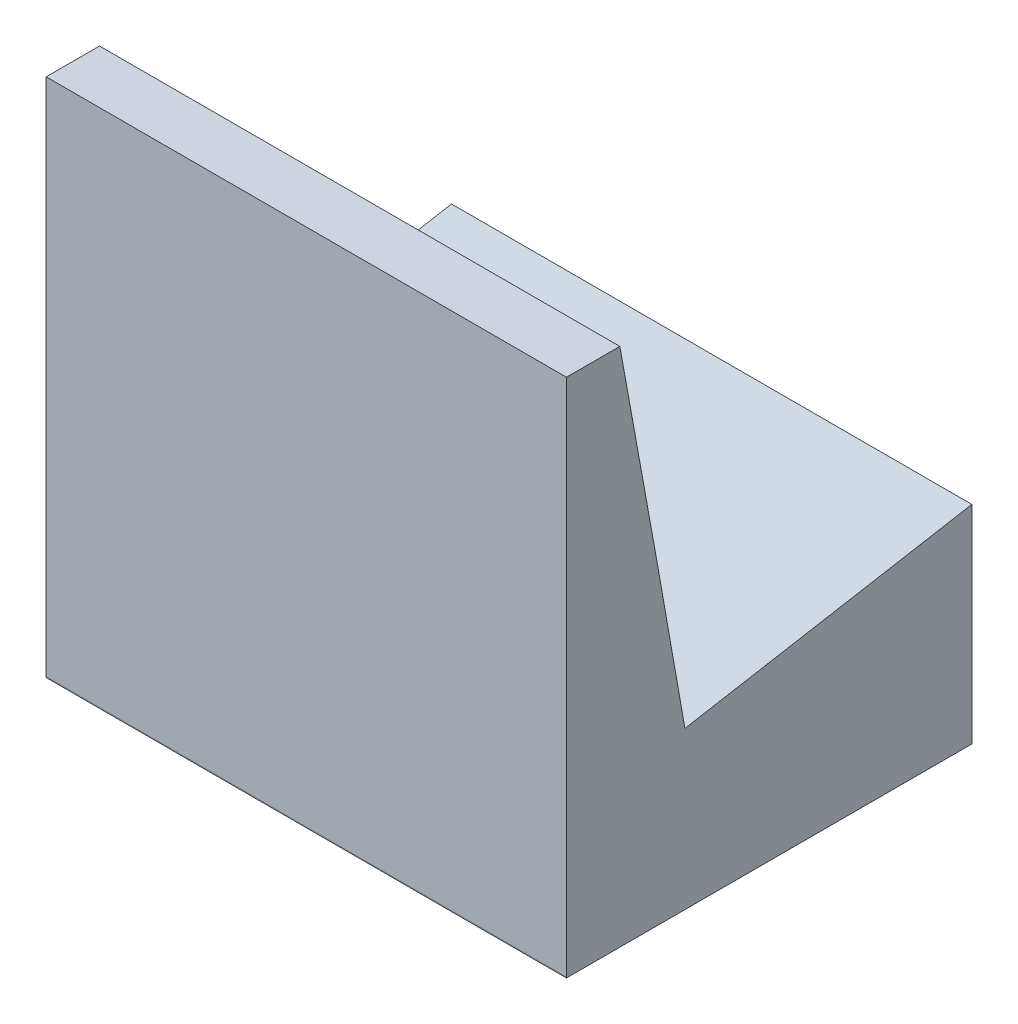
ISO-10303-21;
HEADER;
FILE_DESCRIPTION(('STEP AP214'),'2;1');
FILE_NAME('part.step','',(''),(''),'','','');
FILE_SCHEMA(('AUTOMOTIVE_DESIGN { 1 0 10303 214 1 1 1 1 }'));
ENDSEC;
DATA;
#1=APPLICATION_CONTEXT('core data for automotive mechanical design processes');
#2=APPLICATION_PROTOCOL_DEFINITION('international standard','automotive_design',2000,#1);
#3=PRODUCT_CONTEXT('',#1,'mechanical');
#4=PRODUCT('Part','Part','',(#3));
#5=PRODUCT_RELATED_PRODUCT_CATEGORY('part','',(#4));
#6=PRODUCT_DEFINITION_FORMATION('','',#4);
#7=PRODUCT_DEFINITION_CONTEXT('part definition',#1,'design');
#8=PRODUCT_DEFINITION('design','',#6,#7);
#9=PRODUCT_DEFINITION_SHAPE('','',#8);
#10=(LENGTH_UNIT() NAMED_UNIT(*) SI_UNIT(.MILLI.,.METRE.));
#11=(NAMED_UNIT(*) PLANE_ANGLE_UNIT() SI_UNIT($,.RADIAN.));
#12=(NAMED_UNIT(*) SI_UNIT($,.STERADIAN.) SOLID_ANGLE_UNIT());
#13=UNCERTAINTY_MEASURE_WITH_UNIT(LENGTH_MEASURE(1.E-05),#10,'distance_accuracy_value','');
#14=(GEOMETRIC_REPRESENTATION_CONTEXT(3) GLOBAL_UNCERTAINTY_ASSIGNED_CONTEXT((#13)) GLOBAL_UNIT_ASSIGNED_CONTEXT((#10,
#11,#12)) REPRESENTATION_CONTEXT('',''));
#15=CARTESIAN_POINT('',(0.,0.,0.));
#16=DIRECTION('',(0.,0.,1.));
#17=DIRECTION('',(1.,0.,0.));
#18=AXIS2_PLACEMENT_3D('',#15,#16,#17);
#19=CARTESIAN_POINT('',(39.,78.,-39.));
#20=DIRECTION('',(1.,0.,0.));
#21=DIRECTION('',(0.,0.,-1.));
#22=AXIS2_PLACEMENT_3D('',#19,#20,#21);
#23=PLANE('',#22);
#24=DIRECTION('',(0.,-1.,0.));
#25=VECTOR('',#24,1.);
#26=CARTESIAN_POINT('',(39.,0.,21.7672531972681));
#27=LINE('',#26,#25);
#28=CARTESIAN_POINT('',(39.,78.,21.7672531972681));
#29=VERTEX_POINT('',#28);
#30=CARTESIAN_POINT('',(39.,0.141749363036681,21.7672531972681));
#31=VERTEX_POINT('',#30);
#32=EDGE_CURVE('E128',#29,#31,#27,.T.);
#33=ORIENTED_EDGE('',*,*,#32,.T.);
#34=DIRECTION('',(0.,0.999966171621233,0.00822530322693927));
#35=VECTOR('',#34,1.);
#36=CARTESIAN_POINT('',(39.,-0.499802585268086,21.7619760594405));
#37=LINE('',#36,#35);
#38=CARTESIAN_POINT('',(39.,0.,21.766087226332));
#39=VERTEX_POINT('',#38);
#40=EDGE_CURVE('E110',#39,#31,#37,.T.);
#41=ORIENTED_EDGE('',*,*,#40,.F.);
#42=DIRECTION('',(0.,0.,1.));
#43=VECTOR('',#42,1.);
#44=CARTESIAN_POINT('',(39.,0.,-39.));
#45=LINE('',#44,#43);
#46=CARTESIAN_POINT('',(39.,0.,-39.));
#47=VERTEX_POINT('',#46);
#48=EDGE_CURVE('E138',#47,#39,#45,.T.);
#49=ORIENTED_EDGE('',*,*,#48,.F.);
#50=DIRECTION('',(0.,-1.,0.));
#51=VECTOR('',#50,1.);
#52=CARTESIAN_POINT('',(39.,78.,-39.));
#53=LINE('',#52,#51);
#54=CARTESIAN_POINT('',(39.,31.1068155014602,-39.));
#55=VERTEX_POINT('',#54);
#56=EDGE_CURVE('E11',#55,#47,#53,.T.);
#57=ORIENTED_EDGE('',*,*,#56,.F.);
#58=DIRECTION('',(0.,-0.173648177666928,0.984807753012209));
#59=VECTOR('',#58,1.);
#60=CARTESIAN_POINT('',(39.,23.4994374473151,4.14358485343244));
#61=LINE('',#60,#59);
#62=CARTESIAN_POINT('',(39.,23.5226202786766,4.01210848340461));
#63=VERTEX_POINT('',#62);
#64=EDGE_CURVE('E143',#55,#63,#61,.T.);
#65=ORIENTED_EDGE('',*,*,#64,.T.);
#66=DIRECTION('',(0.,0.984807753012209,0.173648177666924));
#67=VECTOR('',#66,1.);
#68=CARTESIAN_POINT('',(39.,0.0231828313614988,-0.131476370027743));
#69=LINE('',#68,#67);
#70=CARTESIAN_POINT('',(39.,48.2851422534618,8.37840921794532));
#71=VERTEX_POINT('',#70);
#72=EDGE_CURVE('E154',#63,#71,#69,.T.);
#73=ORIENTED_EDGE('',*,*,#72,.T.);
#74=DIRECTION('',(0.,0.983950569584254,0.178441241350822));
#75=VECTOR('',#74,1.);
#76=CARTESIAN_POINT('',(39.,0.0664015904735085,-0.366147883040432));
#77=LINE('',#76,#75);
#78=CARTESIAN_POINT('',(39.,78.,13.7672531972681));
#79=VERTEX_POINT('',#78);
#80=EDGE_CURVE('E150',#71,#79,#77,.T.);
#81=ORIENTED_EDGE('',*,*,#80,.T.);
#82=DIRECTION('',(0.,0.,1.));
#83=VECTOR('',#82,1.);
#84=CARTESIAN_POINT('',(39.,78.,-39.));
#85=LINE('',#84,#83);
#86=EDGE_CURVE('E172',#79,#29,#85,.T.);
#87=ORIENTED_EDGE('',*,*,#86,.T.);
#88=EDGE_LOOP('',(#33,#41,#49,#57,#65,#73,#81,#87));
#89=FACE_BOUND('',#88,.T.);
#90=ADVANCED_FACE('F39',(#89),#23,.T.);
#91=CARTESIAN_POINT('',(-39.,78.,-39.));
#92=DIRECTION('',(1.,0.,0.));
#93=DIRECTION('',(0.,0.,-1.));
#94=AXIS2_PLACEMENT_3D('',#91,#92,#93);
#95=PLANE('',#94);
#96=DIRECTION('',(0.,0.999966171621233,0.00822530322693927));
#97=VECTOR('',#96,1.);
#98=CARTESIAN_POINT('',(-39.,-0.499802585268086,21.7619760594405));
#99=LINE('',#98,#97);
#100=CARTESIAN_POINT('',(-39.,0.,21.766087226332));
#101=VERTEX_POINT('',#100);
#102=CARTESIAN_POINT('',(-39.,0.141749363036681,21.7672531972681));
#103=VERTEX_POINT('',#102);
#104=EDGE_CURVE('E107',#101,#103,#99,.T.);
#105=ORIENTED_EDGE('',*,*,#104,.T.);
#106=DIRECTION('',(0.,-1.,0.));
#107=VECTOR('',#106,1.);
#108=CARTESIAN_POINT('',(-39.,0.,21.7672531972681));
#109=LINE('',#108,#107);
#110=CARTESIAN_POINT('',(-39.,78.,21.7672531972681));
#111=VERTEX_POINT('',#110);
#112=EDGE_CURVE('E116',#111,#103,#109,.T.);
#113=ORIENTED_EDGE('',*,*,#112,.F.);
#114=DIRECTION('',(0.,0.,1.));
#115=VECTOR('',#114,1.);
#116=CARTESIAN_POINT('',(-39.,78.,-39.));
#117=LINE('',#116,#115);
#118=CARTESIAN_POINT('',(-39.,78.,13.7672531972681));
#119=VERTEX_POINT('',#118);
#120=EDGE_CURVE('E176',#119,#111,#117,.T.);
#121=ORIENTED_EDGE('',*,*,#120,.F.);
#122=DIRECTION('',(0.,0.983950569584254,0.178441241350822));
#123=VECTOR('',#122,1.);
#124=CARTESIAN_POINT('',(-39.,0.0664015904735085,-0.366147883040418));
#125=LINE('',#124,#123);
#126=CARTESIAN_POINT('',(-39.,48.2851422534618,8.37840921794534));
#127=VERTEX_POINT('',#126);
#128=EDGE_CURVE('E54',#127,#119,#125,.T.);
#129=ORIENTED_EDGE('',*,*,#128,.F.);
#130=DIRECTION('',(0.,0.984807753012209,0.173648177666924));
#131=VECTOR('',#130,1.);
#132=CARTESIAN_POINT('',(-39.,0.0231828313614988,-0.131476370027729));
#133=LINE('',#132,#131);
#134=CARTESIAN_POINT('',(-39.,23.5226202786766,4.01210848340462));
#135=VERTEX_POINT('',#134);
#136=EDGE_CURVE('E142',#135,#127,#133,.T.);
#137=ORIENTED_EDGE('',*,*,#136,.F.);
#138=DIRECTION('',(0.,-0.173648177666928,0.984807753012209));
#139=VECTOR('',#138,1.);
#140=CARTESIAN_POINT('',(-39.,23.4994374473151,4.14358485343245));
#141=LINE('',#140,#139);
#142=CARTESIAN_POINT('',(-39.,31.1068155014602,-39.));
#143=VERTEX_POINT('',#142);
#144=EDGE_CURVE('E146',#143,#135,#141,.T.);
#145=ORIENTED_EDGE('',*,*,#144,.F.);
#146=DIRECTION('',(0.,-1.,0.));
#147=VECTOR('',#146,1.);
#148=CARTESIAN_POINT('',(-39.,78.,-39.));
#149=LINE('',#148,#147);
#150=CARTESIAN_POINT('',(-39.,0.,-39.));
#151=VERTEX_POINT('',#150);
#152=EDGE_CURVE('E47',#143,#151,#149,.T.);
#153=ORIENTED_EDGE('',*,*,#152,.T.);
#154=DIRECTION('',(0.,0.,1.));
#155=VECTOR('',#154,1.);
#156=CARTESIAN_POINT('',(-39.,0.,-39.));
#157=LINE('',#156,#155);
#158=EDGE_CURVE('E122',#151,#101,#157,.T.);
#159=ORIENTED_EDGE('',*,*,#158,.T.);
#160=EDGE_LOOP('',(#105,#113,#121,#129,#137,#145,#153,#159));
#161=FACE_BOUND('',#160,.T.);
#162=ADVANCED_FACE('F119',(#161),#95,.F.);
#163=CARTESIAN_POINT('',(0.,0.,0.));
#164=DIRECTION('',(0.,-1.,0.));
#165=DIRECTION('',(0.,0.,-1.));
#166=AXIS2_PLACEMENT_3D('',#163,#164,#165);
#167=PLANE('',#166);
#168=ORIENTED_EDGE('',*,*,#48,.T.);
#169=DIRECTION('',(-1.,0.,0.));
#170=VECTOR('',#169,1.);
#171=CARTESIAN_POINT('',(0.,0.,21.766087226332));
#172=LINE('',#171,#170);
#173=EDGE_CURVE('E134',#39,#101,#172,.T.);
#174=ORIENTED_EDGE('',*,*,#173,.T.);
#175=ORIENTED_EDGE('',*,*,#158,.F.);
#176=DIRECTION('',(1.,0.,0.));
#177=VECTOR('',#176,1.);
#178=CARTESIAN_POINT('',(-39.,0.,-39.));
#179=LINE('',#178,#177);
#180=EDGE_CURVE('E182',#151,#47,#179,.T.);
#181=ORIENTED_EDGE('',*,*,#180,.T.);
#182=EDGE_LOOP('',(#168,#174,#175,#181));
#183=FACE_BOUND('',#182,.T.);
#184=ADVANCED_FACE('F190',(#183),#167,.T.);
#185=CARTESIAN_POINT('',(-39.,78.,-39.));
#186=DIRECTION('',(0.,0.,-1.));
#187=DIRECTION('',(-1.,0.,0.));
#188=AXIS2_PLACEMENT_3D('',#185,#186,#187);
#189=PLANE('',#188);
#190=ORIENTED_EDGE('',*,*,#152,.F.);
#191=DIRECTION('',(1.,0.,0.));
#192=VECTOR('',#191,1.);
#193=CARTESIAN_POINT('',(-39.,31.1068155014602,-39.));
#194=LINE('',#193,#192);
#195=EDGE_CURVE('E163',#143,#55,#194,.T.);
#196=ORIENTED_EDGE('',*,*,#195,.T.);
#197=ORIENTED_EDGE('',*,*,#56,.T.);
#198=ORIENTED_EDGE('',*,*,#180,.F.);
#199=EDGE_LOOP('',(#190,#196,#197,#198));
#200=FACE_BOUND('',#199,.T.);
#201=ADVANCED_FACE('F193',(#200),#189,.T.);
#202=CARTESIAN_POINT('',(0.,78.,0.));
#203=DIRECTION('',(0.,-1.,0.));
#204=DIRECTION('',(0.,0.,-1.));
#205=AXIS2_PLACEMENT_3D('',#202,#203,#204);
#206=PLANE('',#205);
#207=DIRECTION('',(1.,0.,0.));
#208=VECTOR('',#207,1.);
#209=CARTESIAN_POINT('',(-39.,78.,21.7672531972681));
#210=LINE('',#209,#208);
#211=EDGE_CURVE('E115',#111,#29,#210,.T.);
#212=ORIENTED_EDGE('',*,*,#211,.T.);
#213=ORIENTED_EDGE('',*,*,#86,.F.);
#214=DIRECTION('',(1.,0.,0.));
#215=VECTOR('',#214,1.);
#216=CARTESIAN_POINT('',(-39.,78.,13.7672531972681));
#217=LINE('',#216,#215);
#218=EDGE_CURVE('E131',#119,#79,#217,.T.);
#219=ORIENTED_EDGE('',*,*,#218,.F.);
#220=ORIENTED_EDGE('',*,*,#120,.T.);
#221=EDGE_LOOP('',(#212,#213,#219,#220));
#222=FACE_BOUND('',#221,.T.);
#223=ADVANCED_FACE('F200',(#222),#206,.F.);
#224=CARTESIAN_POINT('',(-39.,0.,21.7672531972681));
#225=DIRECTION('',(0.,0.,1.));
#226=DIRECTION('',(1.,0.,0.));
#227=AXIS2_PLACEMENT_3D('',#224,#225,#226);
#228=PLANE('',#227);
#229=ORIENTED_EDGE('',*,*,#32,.F.);
#230=ORIENTED_EDGE('',*,*,#211,.F.);
#231=ORIENTED_EDGE('',*,*,#112,.T.);
#232=DIRECTION('',(1.,0.,0.));
#233=VECTOR('',#232,1.);
#234=CARTESIAN_POINT('',(-39.,0.141749363036681,21.7672531972681));
#235=LINE('',#234,#233);
#236=EDGE_CURVE('E104',#103,#31,#235,.T.);
#237=ORIENTED_EDGE('',*,*,#236,.T.);
#238=EDGE_LOOP('',(#229,#230,#231,#237));
#239=FACE_BOUND('',#238,.T.);
#240=ADVANCED_FACE('F125',(#239),#228,.T.);
#241=CARTESIAN_POINT('',(-39.,0.0664015904735085,-0.366147883040418));
#242=DIRECTION('',(0.,0.178441241350822,-0.983950569584254));
#243=DIRECTION('',(0.,0.983950569584254,0.178441241350822));
#244=AXIS2_PLACEMENT_3D('',#241,#242,#243);
#245=PLANE('',#244);
#246=ORIENTED_EDGE('',*,*,#80,.F.);
#247=DIRECTION('',(1.,0.,0.));
#248=VECTOR('',#247,1.);
#249=CARTESIAN_POINT('',(-39.,48.2851422534618,8.37840921794534));
#250=LINE('',#249,#248);
#251=EDGE_CURVE('E149',#127,#71,#250,.T.);
#252=ORIENTED_EDGE('',*,*,#251,.F.);
#253=ORIENTED_EDGE('',*,*,#128,.T.);
#254=ORIENTED_EDGE('',*,*,#218,.T.);
#255=EDGE_LOOP('',(#246,#252,#253,#254));
#256=FACE_BOUND('',#255,.T.);
#257=ADVANCED_FACE('F207',(#256),#245,.T.);
#258=CARTESIAN_POINT('',(-39.,23.4994374473151,4.14358485343245));
#259=DIRECTION('',(0.,0.984807753012209,0.173648177666928));
#260=DIRECTION('',(0.,-0.173648177666928,0.984807753012209));
#261=AXIS2_PLACEMENT_3D('',#258,#259,#260);
#262=PLANE('',#261);
#263=ORIENTED_EDGE('',*,*,#64,.F.);
#264=ORIENTED_EDGE('',*,*,#195,.F.);
#265=ORIENTED_EDGE('',*,*,#144,.T.);
#266=DIRECTION('',(1.,0.,0.));
#267=VECTOR('',#266,1.);
#268=CARTESIAN_POINT('',(-39.,23.5226202786766,4.01210848340462));
#269=LINE('',#268,#267);
#270=EDGE_CURVE('E167',#135,#63,#269,.T.);
#271=ORIENTED_EDGE('',*,*,#270,.T.);
#272=EDGE_LOOP('',(#263,#264,#265,#271));
#273=FACE_BOUND('',#272,.T.);
#274=ADVANCED_FACE('F209',(#273),#262,.T.);
#275=CARTESIAN_POINT('',(-39.,0.0231828313614988,-0.131476370027729));
#276=DIRECTION('',(0.,0.173648177666924,-0.984807753012209));
#277=DIRECTION('',(0.,0.984807753012209,0.173648177666924));
#278=AXIS2_PLACEMENT_3D('',#275,#276,#277);
#279=PLANE('',#278);
#280=ORIENTED_EDGE('',*,*,#72,.F.);
#281=ORIENTED_EDGE('',*,*,#270,.F.);
#282=ORIENTED_EDGE('',*,*,#136,.T.);
#283=ORIENTED_EDGE('',*,*,#251,.T.);
#284=EDGE_LOOP('',(#280,#281,#282,#283));
#285=FACE_BOUND('',#284,.T.);
#286=ADVANCED_FACE('F205',(#285),#279,.T.);
#287=CARTESIAN_POINT('',(-39.,-0.499802585268086,21.7619760594405));
#288=DIRECTION('',(0.,-0.00822530322693927,0.999966171621233));
#289=DIRECTION('',(0.,-0.999966171621233,-0.00822530322693927));
#290=AXIS2_PLACEMENT_3D('',#287,#288,#289);
#291=PLANE('',#290);
#292=ORIENTED_EDGE('',*,*,#40,.T.);
#293=ORIENTED_EDGE('',*,*,#236,.F.);
#294=ORIENTED_EDGE('',*,*,#104,.F.);
#295=ORIENTED_EDGE('',*,*,#173,.F.);
#296=EDGE_LOOP('',(#292,#293,#294,#295));
#297=FACE_BOUND('',#296,.T.);
#298=ADVANCED_FACE('F106',(#297),#291,.T.);
#299=CLOSED_SHELL('',(#90,#162,#184,#201,#223,#240,#257,#274,#286,#298));
#300=MANIFOLD_SOLID_BREP('B2',#299);
#301=ADVANCED_BREP_SHAPE_REPRESENTATION('',(#18,#300),#14);
#302=SHAPE_DEFINITION_REPRESENTATION(#9,#301);
ENDSEC;
END-ISO-10303-21;
